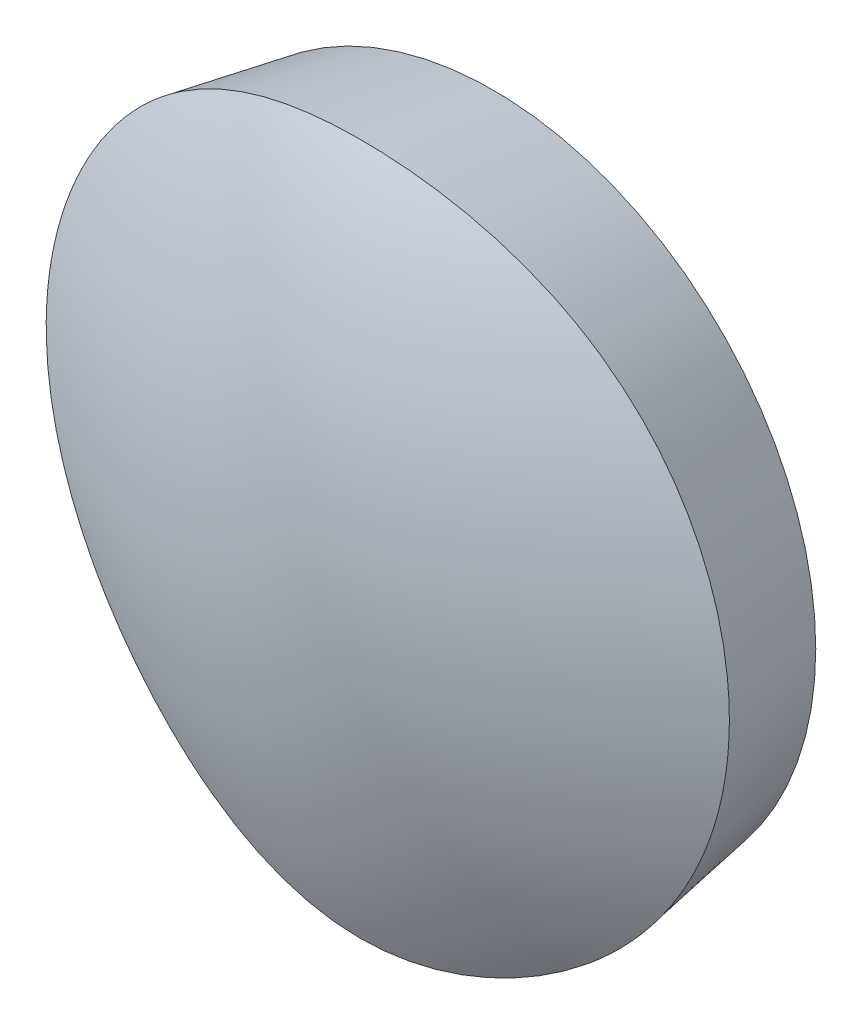
ISO-10303-21;
HEADER;
FILE_DESCRIPTION(('STEP AP214'),'2;1');
FILE_NAME('part.step','',(''),(''),'','','');
FILE_SCHEMA(('AUTOMOTIVE_DESIGN { 1 0 10303 214 1 1 1 1 }'));
ENDSEC;
DATA;
#1=APPLICATION_CONTEXT('core data for automotive mechanical design processes');
#2=APPLICATION_PROTOCOL_DEFINITION('international standard','automotive_design',2000,#1);
#3=PRODUCT_CONTEXT('',#1,'mechanical');
#4=PRODUCT('Part','Part','',(#3));
#5=PRODUCT_RELATED_PRODUCT_CATEGORY('part','',(#4));
#6=PRODUCT_DEFINITION_FORMATION('','',#4);
#7=PRODUCT_DEFINITION_CONTEXT('part definition',#1,'design');
#8=PRODUCT_DEFINITION('design','',#6,#7);
#9=PRODUCT_DEFINITION_SHAPE('','',#8);
#10=(LENGTH_UNIT() NAMED_UNIT(*) SI_UNIT(.MILLI.,.METRE.));
#11=(NAMED_UNIT(*) PLANE_ANGLE_UNIT() SI_UNIT($,.RADIAN.));
#12=(NAMED_UNIT(*) SI_UNIT($,.STERADIAN.) SOLID_ANGLE_UNIT());
#13=UNCERTAINTY_MEASURE_WITH_UNIT(LENGTH_MEASURE(1.E-05),#10,'distance_accuracy_value','');
#14=(GEOMETRIC_REPRESENTATION_CONTEXT(3) GLOBAL_UNCERTAINTY_ASSIGNED_CONTEXT((#13)) GLOBAL_UNIT_ASSIGNED_CONTEXT((#10,
#11,#12)) REPRESENTATION_CONTEXT('',''));
#15=CARTESIAN_POINT('',(0.,0.,0.));
#16=DIRECTION('',(0.,0.,1.));
#17=DIRECTION('',(1.,0.,0.));
#18=AXIS2_PLACEMENT_3D('',#15,#16,#17);
#19=CARTESIAN_POINT('',(0.,0.,0.));
#20=DIRECTION('',(0.,0.,1.));
#21=DIRECTION('',(1.,0.,0.));
#22=AXIS2_PLACEMENT_3D('',#19,#20,#21);
#23=CONICAL_SURFACE('',#22,15.,0.174532925199433);
#24=CARTESIAN_POINT('',(16.2329375433538,0.,6.99233627434661));
#25=CARTESIAN_POINT('',(16.2329350506365,-0.460523017316879,6.99233538323124));
#26=CARTESIAN_POINT('',(16.2134643773844,-0.921100037265326,6.99312577285012));
#27=CARTESIAN_POINT('',(16.1357299482676,-1.83900667263869,6.99639572411422));
#28=CARTESIAN_POINT('',(16.0774600113986,-2.2963357589102,6.99887555490113));
#29=CARTESIAN_POINT('',(15.922547334345,-3.20477158220653,7.00585027145508));
#30=CARTESIAN_POINT('',(15.8258774904151,-3.65587369084304,7.01034658079979));
#31=CARTESIAN_POINT('',(15.5949582506572,-4.54829860450103,7.02186163795036));
#32=CARTESIAN_POINT('',(15.460710315711,-4.98962178896732,7.028880287701));
#33=CARTESIAN_POINT('',(15.155803025611,-5.85916261300328,7.04607907245716));
#34=CARTESIAN_POINT('',(14.9851640575608,-6.28738743762138,7.05625743876467));
#35=CARTESIAN_POINT('',(14.6087865350685,-7.12801155964044,7.0804846729437));
#36=CARTESIAN_POINT('',(14.4030476940963,-7.54041072781849,7.09453357241202));
#37=CARTESIAN_POINT('',(13.9581305813142,-8.34644766004869,7.12717788739682));
#38=CARTESIAN_POINT('',(13.7189597372362,-8.74008956550487,7.14577229370377));
#39=CARTESIAN_POINT('',(13.2089763103295,-9.50602196981985,7.18804987362095));
#40=CARTESIAN_POINT('',(12.9381636453991,-9.87831241327377,7.21173306043529));
#41=CARTESIAN_POINT('',(12.364988713428,-10.601452184396,7.26465032665017));
#42=CARTESIAN_POINT('',(12.0624259396931,-10.9521399304152,7.29392077409049));
#43=CARTESIAN_POINT('',(11.429491665735,-11.6269226708874,7.3578173992772));
#44=CARTESIAN_POINT('',(11.099120016959,-11.9510175232651,7.39244360563444));
#45=CARTESIAN_POINT('',(10.4127610343185,-12.5705134000592,7.46649776169558));
#46=CARTESIAN_POINT('',(10.0567640564997,-12.865903522283,7.50592752309806));
#47=CARTESIAN_POINT('',(9.32165493208127,-13.4258002355531,7.58846918184698));
#48=CARTESIAN_POINT('',(8.94254249433459,-13.6903064374838,7.63158112557451));
#49=CARTESIAN_POINT('',(8.1601138842932,-14.1887692062153,7.72021873328189));
#50=CARTESIAN_POINT('',(7.75660954284019,-14.4224272771396,7.76576272699438));
#51=CARTESIAN_POINT('',(6.93110843402644,-14.8544942423622,7.85664208335077));
#52=CARTESIAN_POINT('',(6.50911152062745,-15.0529028582283,7.90197744434395));
#53=CARTESIAN_POINT('',(5.64945944780644,-15.4126348933501,7.98970063933227));
#54=CARTESIAN_POINT('',(5.21180952180036,-15.5739705760432,8.03208944477938));
#55=CARTESIAN_POINT('',(4.32352469610122,-15.8579598083201,8.11089345920394));
#56=CARTESIAN_POINT('',(3.87288979540866,-15.9806133549265,8.14730866772157));
#57=CARTESIAN_POINT('',(3.12003995406508,-16.1500777003267,8.19993879493228));
#58=CARTESIAN_POINT('',(2.8205614061218,-16.2084386036003,8.21877918567422));
#59=CARTESIAN_POINT('',(2.21844345423287,-16.3076216274538,8.25170277639331));
#60=CARTESIAN_POINT('',(1.91580416062319,-16.3484443581778,8.26578614186128));
#61=CARTESIAN_POINT('',(1.3084466932274,-16.4122226172115,8.28838686259572));
#62=CARTESIAN_POINT('',(1.00372871793955,-16.4351798281008,8.29690474200913));
#63=CARTESIAN_POINT('',(0.546091751428606,-16.4560422099295,8.30498417953992));
#64=CARTESIAN_POINT('',(0.39349545299342,-16.460734680831,8.30689455012238));
#65=CARTESIAN_POINT('',(0.0882191899482709,-16.46558366511,8.30906465989925));
#66=CARTESIAN_POINT('',(-0.0644607747244473,-16.4657401750806,8.30932439785389));
#67=CARTESIAN_POINT('',(-0.522410904243666,-16.4593993377146,8.30762251210617));
#68=CARTESIAN_POINT('',(-0.827609274963285,-16.4460924427115,8.30318011123243));
#69=CARTESIAN_POINT('',(-1.43647946926088,-16.401506686933,8.28835432809196));
#70=CARTESIAN_POINT('',(-1.74015139322481,-16.3702290240162,8.27797134180079));
#71=CARTESIAN_POINT('',(-2.4553610919574,-16.2753091280364,8.2472593364961));
#72=CARTESIAN_POINT('',(-2.86581105863856,-16.2040206133411,8.22468324415793));
#73=CARTESIAN_POINT('',(-3.67924312218226,-16.0293694890661,8.17196590477111));
#74=CARTESIAN_POINT('',(-4.08222574964094,-15.9260091677,8.14182519746118));
#75=CARTESIAN_POINT('',(-4.87875903333329,-15.6882097416447,8.07618420925249));
#76=CARTESIAN_POINT('',(-5.27230304784517,-15.5537494221088,8.04068027559295));
#77=CARTESIAN_POINT('',(-6.0475780441396,-15.2549634979909,7.96651209674264));
#78=CARTESIAN_POINT('',(-6.42930838448292,-15.0906362750631,7.92784768036283));
#79=CARTESIAN_POINT('',(-7.20269696333746,-14.7220583039283,7.84690054644939));
#80=CARTESIAN_POINT('',(-7.59345889518589,-14.5159412376786,7.80454355504945));
#81=CARTESIAN_POINT('',(-8.35719443699002,-14.072890233416,7.72065282150741));
#82=CARTESIAN_POINT('',(-8.73016755296308,-13.835955440297,7.6791191022457));
#83=CARTESIAN_POINT('',(-9.45613452389717,-13.3329152512586,7.59857531839341));
#84=CARTESIAN_POINT('',(-9.80913015007783,-13.0668124475605,7.55956503002951));
#85=CARTESIAN_POINT('',(-10.4930630733083,-12.5071462216778,7.48530376854955));
#86=CARTESIAN_POINT('',(-10.8239999126955,-12.2135822300486,7.45005287342202));
#87=CARTESIAN_POINT('',(-11.4788242686162,-11.5844330240495,7.38232390471772));
#88=CARTESIAN_POINT('',(-11.8013865172103,-11.2474397017763,7.3500952134875));
#89=CARTESIAN_POINT('',(-12.4173976839349,-10.5473586450054,7.29106735858224));
#90=CARTESIAN_POINT('',(-12.7108454588814,-10.1842698868309,7.26426840806375));
#91=CARTESIAN_POINT('',(-13.2664535802036,-9.43447486852502,7.21602994430587));
#92=CARTESIAN_POINT('',(-13.5286094575026,-9.04776524678006,7.19459119612762));
#93=CARTESIAN_POINT('',(-14.0195489650635,-8.25348627018925,7.15666644747792));
#94=CARTESIAN_POINT('',(-14.2483330065026,-7.8459171724384,7.14018038598136));
#95=CARTESIAN_POINT('',(-14.6700599205629,-7.01408544279394,7.11157256758852));
#96=CARTESIAN_POINT('',(-14.8631119610546,-6.58987862216499,7.09943740772708));
#97=CARTESIAN_POINT('',(-15.2126977611312,-5.72658760495567,7.0787384157425));
#98=CARTESIAN_POINT('',(-15.3692314770233,-5.28750339057577,7.07017458789232));
#99=CARTESIAN_POINT('',(-15.6444898933025,-4.39763118198355,7.05591179477935));
#100=CARTESIAN_POINT('',(-15.763217652592,-3.94684413784775,7.05021259771597));
#101=CARTESIAN_POINT('',(-15.9618985565273,-3.03678256456115,7.04107349460571));
#102=CARTESIAN_POINT('',(-16.0418519979273,-2.57750810039565,7.0376335712677));
#103=CARTESIAN_POINT('',(-16.1617925000944,-1.65783658736649,7.03259715981417));
#104=CARTESIAN_POINT('',(-16.2021220631791,-1.1974842676981,7.03098485504156));
#105=CARTESIAN_POINT('',(-16.2436934492337,-0.275016373869985,7.02932423751949));
#106=CARTESIAN_POINT('',(-16.2449355022461,0.187099189896476,7.0292759155655));
#107=CARTESIAN_POINT('',(-16.2083221348484,1.1097697461297,7.0307361511741));
#108=CARTESIAN_POINT('',(-16.1704672012166,1.57032475795454,7.03224468935294));
#109=CARTESIAN_POINT('',(-16.0559729856069,2.48657801343192,7.03703096508028));
#110=CARTESIAN_POINT('',(-15.9793337369832,2.9422762612609,7.04030870110727));
#111=CARTESIAN_POINT('',(-15.7883366457704,3.84350495389779,7.04902758618363));
#112=CARTESIAN_POINT('',(-15.6741521305736,4.28907224710213,7.05445881692887));
#113=CARTESIAN_POINT('',(-15.4088961593837,5.16904166616969,7.06805491065101));
#114=CARTESIAN_POINT('',(-15.257824853959,5.60344383759989,7.07621976246959));
#115=CARTESIAN_POINT('',(-14.919998834778,6.45805956541507,7.09595628375649));
#116=CARTESIAN_POINT('',(-14.7332442574069,6.87827317602299,7.10752794020373));
#117=CARTESIAN_POINT('',(-14.3255156951282,7.70161831526981,7.13477414608707));
#118=CARTESIAN_POINT('',(-14.1045415185185,8.10474974819624,7.15044871850852));
#119=CARTESIAN_POINT('',(-13.6286676675719,8.89350778438035,7.18662665085548));
#120=CARTESIAN_POINT('',(-13.3735746640395,9.27901646378208,7.20715808265794));
#121=CARTESIAN_POINT('',(-12.8324258158974,10.0273174600794,7.25343367413362));
#122=CARTESIAN_POINT('',(-12.546369890998,10.3901097180654,7.2791778473241));
#123=CARTESIAN_POINT('',(-11.9453983563715,11.090520745059,7.335999860154));
#124=CARTESIAN_POINT('',(-11.6304816172244,11.4281385279667,7.36707790856735));
#125=CARTESIAN_POINT('',(-10.9740448998126,12.0758906906912,7.43426403954389));
#126=CARTESIAN_POINT('',(-10.6325247304149,12.3860248730172,7.47037215824721));
#127=CARTESIAN_POINT('',(-9.92215435711165,12.9792397696738,7.54714415483503));
#128=CARTESIAN_POINT('',(-9.55309355129009,13.2620636439469,7.58784469255664));
#129=CARTESIAN_POINT('',(-8.79274851701214,13.7955634024818,7.6721540023946));
#130=CARTESIAN_POINT('',(-8.40146395137314,14.0462387987935,7.71576281863758));
#131=CARTESIAN_POINT('',(-7.59891280368938,14.51368935129,7.80397013614706));
#132=CARTESIAN_POINT('',(-7.18763663009369,14.7304480202824,7.8485691067814));
#133=CARTESIAN_POINT('',(-6.55799849477026,15.0286171793838,7.9143261266684));
#134=CARTESIAN_POINT('',(-6.3459908929724,15.1235149166938,7.93605562816824));
#135=CARTESIAN_POINT('',(-5.91796351533206,15.3041587218035,7.97879415292774));
#136=CARTESIAN_POINT('',(-5.70194252084854,15.3899019547601,7.9998029516509));
#137=CARTESIAN_POINT('',(-5.04859377698245,15.6329773420885,8.06118246265301));
#138=CARTESIAN_POINT('',(-4.60577810163943,15.7762510354259,8.09992802618263));
#139=CARTESIAN_POINT('',(-3.70881651279742,16.0235444308514,8.16997137536504));
#140=CARTESIAN_POINT('',(-3.25467166966495,16.1275678263998,8.20126986168669));
#141=CARTESIAN_POINT('',(-2.33893035236762,16.2948403874664,8.25328512150628));
#142=CARTESIAN_POINT('',(-1.87734492039049,16.3581451302825,8.27401631035414));
#143=CARTESIAN_POINT('',(-0.949982516405334,16.4430482249982,8.30211868641025));
#144=CARTESIAN_POINT('',(-0.484206352505674,16.4646544515976,8.30949239614149));
#145=CARTESIAN_POINT('',(0.411691055030618,16.465504600773,8.30860938867899));
#146=CARTESIAN_POINT('',(0.841813610762723,16.4478632888738,8.30150542989539));
#147=CARTESIAN_POINT('',(1.6987582205229,16.3769748511482,8.27570086600569));
#148=CARTESIAN_POINT('',(2.1255801215277,16.3237260843999,8.25699972646192));
#149=CARTESIAN_POINT('',(2.97322859214292,16.1824234888934,8.21019597909793));
#150=CARTESIAN_POINT('',(3.3940499730568,16.0943412308331,8.18208569490388));
#151=CARTESIAN_POINT('',(4.22667307063172,15.8844696150106,8.11889364137408));
#152=CARTESIAN_POINT('',(4.63847413837582,15.7626778407403,8.08381137229388));
#153=CARTESIAN_POINT('',(5.44666654166061,15.4879786903716,8.00950195478744));
#154=CARTESIAN_POINT('',(5.84316860176516,15.3353845793175,7.97031831032127));
#155=CARTESIAN_POINT('',(6.62277773935038,14.9996610724847,7.88980178346751));
#156=CARTESIAN_POINT('',(7.00588508833568,14.8165322960642,7.84846894468538));
#157=CARTESIAN_POINT('',(7.75664129268153,14.4211113561911,7.76569387931191));
#158=CARTESIAN_POINT('',(8.1242926765558,14.208823987368,7.72425167180093));
#159=CARTESIAN_POINT('',(8.84227742623399,13.7564575558658,7.64296049319375));
#160=CARTESIAN_POINT('',(9.19260992351844,13.5163771014133,7.60311160201941));
#161=CARTESIAN_POINT('',(9.90331879246726,12.9881427891376,7.52305262490856));
#162=CARTESIAN_POINT('',(10.2619759257001,12.6976313476021,7.48310515789943));
#163=CARTESIAN_POINT('',(10.954242066482,12.0875856519751,7.4078567159684));
#164=CARTESIAN_POINT('',(11.2878497234832,11.7680498350776,7.37255599149945));
#165=CARTESIAN_POINT('',(11.9277914025325,11.1020305895863,7.3072297626034));
#166=CARTESIAN_POINT('',(12.2341162043526,10.755538124564,7.2772060382244));
#167=CARTESIAN_POINT('',(12.8171333036967,10.0380692195028,7.22260316472862));
#168=CARTESIAN_POINT('',(13.0938261416005,9.66709322615428,7.19802391631555));
#169=CARTESIAN_POINT('',(13.6179834299141,8.89956425148705,7.15386001517399));
#170=CARTESIAN_POINT('',(13.8651459573239,8.50280215547214,7.13432491562787));
#171=CARTESIAN_POINT('',(14.3252311730872,7.6896705487691,7.100019830267));
#172=CARTESIAN_POINT('',(14.5381520270407,7.27329998915729,7.08525009970067));
#173=CARTESIAN_POINT('',(14.927882971685,6.42424281894259,7.0597873305662));
#174=CARTESIAN_POINT('',(15.1047192895241,5.99156833137125,7.04909132617669));
#175=CARTESIAN_POINT('',(15.4210106347235,5.11274866417483,7.03102135067298));
#176=CARTESIAN_POINT('',(15.5604722248203,4.66660586481778,7.02364679618081));
#177=CARTESIAN_POINT('',(15.7721180475358,3.87208890350441,7.01299025533802));
#178=CARTESIAN_POINT('',(15.8524155148761,3.52585827660826,7.00915125927472));
#179=CARTESIAN_POINT('',(15.9903698942407,2.8288184241674,7.00275724025257));
#180=CARTESIAN_POINT('',(16.0480225505475,2.47800835077889,7.00020245861534));
#181=CARTESIAN_POINT('',(16.1403746714526,1.77338415116071,6.99619180696904));
#182=CARTESIAN_POINT('',(16.1750748295286,1.41957011601869,6.99473590375869));
#183=CARTESIAN_POINT('',(16.221355004218,0.710514575283663,6.99280857582398));
#184=CARTESIAN_POINT('',(16.2329394663761,0.355273357332807,6.99233696180313));
#185=CARTESIAN_POINT('',(16.2329375433538,0.,6.99233627434661));
#186=B_SPLINE_CURVE_WITH_KNOTS('',3,(#24,#25,#26,#27,#28,#29,#30,#31,#32,#33,#34,#35,#36,#37,
#38,#39,#40,#41,#42,#43,#44,#45,#46,#47,#48,#49,#50,#51,#52,#53,#54,#55,#56,#57,#58,#59,#60,#61,
#62,#63,#64,#65,#66,#67,#68,#69,#70,#71,#72,#73,#74,#75,#76,#77,#78,#79,#80,#81,#82,#83,#84,#85,
#86,#87,#88,#89,#90,#91,#92,#93,#94,#95,#96,#97,#98,#99,#100,#101,#102,#103,#104,#105,#106,#107,
#108,#109,#110,#111,#112,#113,#114,#115,#116,#117,#118,#119,#120,#121,#122,#123,#124,#125,#126,
#127,#128,#129,#130,#131,#132,#133,#134,#135,#136,#137,#138,#139,#140,#141,#142,#143,#144,#145,
#146,#147,#148,#149,#150,#151,#152,#153,#154,#155,#156,#157,#158,#159,#160,#161,#162,#163,#164,
#165,#166,#167,#168,#169,#170,#171,#172,#173,#174,#175,#176,#177,#178,#179,#180,#181,#182,#183,
#184,#185),.UNSPECIFIED.,.T.,.F.,(4,2,2,2,2,2,2,2,2,2,2,2,2,2,2,2,2,2,2,2,2,2,2,2,2,2,2,2,2,2,2,
2,2,2,2,2,2,2,2,2,2,2,2,2,2,2,2,2,2,2,2,2,2,2,2,2,2,2,2,2,2,2,2,2,2,2,2,2,2,2,2,2,2,2,2,2,2,2,2,
2,4),(0.,1.38125141153327,2.76272291910475,4.14517124607608,5.52756583659712,6.9091880024121,
8.29082144733392,9.67214841526834,11.0534789674438,12.4441278448426,13.8347841514436,
15.225966588304,16.6171665511978,18.0209709652909,19.4247864674083,20.8281369276605,
22.231487495936,23.1480666114915,24.0646138371467,24.9810747316715,25.439049469102,
25.8970245505151,26.8129208351914,27.7287560770112,28.9788884942431,30.2289317393032,
31.4798302287625,32.7307965186891,34.0607921161901,35.3908246252365,36.7207390272419,
38.0506810129298,39.451803243259,40.852980467106,42.2543575668164,43.6557173985805,
45.0527224759946,46.4497292248651,47.846622912346,49.2435059087125,50.6282053688468,
52.0128966795862,53.3975707503914,54.7822436303868,56.1606118814887,57.5389745063138,
58.9173318629972,60.2956969416794,61.6822322702041,63.0687711942236,64.455364401332,
65.8419675713713,67.2405487126603,68.639151079128,70.0384312192852,70.7381198499617,
71.4380245261346,72.8371617742992,74.2361673305413,75.6332592951621,77.0300873953149,
78.320040467178,79.610052988901,80.9011205324697,82.1922806517843,83.4709171227311,
84.7495276612623,86.0279282053893,87.30639279473,88.6946002138487,90.0828824248026,
91.4716320388267,92.8603563227666,94.2622445604488,95.6642078752915,97.065148549657,
98.4658430673772,99.5314551162832,100.597267333631,101.663047347481,102.728622373796),.UNSPECIFIED.);
#187=CARTESIAN_POINT('',(16.2329375433538,0.,6.99233627434661));
#188=VERTEX_POINT('',#187);
#189=EDGE_CURVE('E10',#188,#188,#186,.T.);
#190=ORIENTED_EDGE('',*,*,#189,.T.);
#191=EDGE_LOOP('',(#190));
#192=FACE_BOUND('',#191,.T.);
#193=CARTESIAN_POINT('',(0.,0.,2.));
#194=DIRECTION('',(0.,0.,-1.));
#195=DIRECTION('',(-1.,0.,0.));
#196=AXIS2_PLACEMENT_3D('',#193,#194,#195);
#197=CIRCLE('',#196,15.3526539614169);
#198=CARTESIAN_POINT('',(-15.3526539614169,0.,2.));
#199=VERTEX_POINT('',#198);
#200=EDGE_CURVE('E43',#199,#199,#197,.T.);
#201=ORIENTED_EDGE('',*,*,#200,.F.);
#202=EDGE_LOOP('',(#201));
#203=FACE_BOUND('',#202,.T.);
#204=ADVANCED_FACE('F36',(#192,#203),#23,.T.);
#205=CARTESIAN_POINT('',(-24.0021039458,11.75,0.00989828675941606));
#206=CARTESIAN_POINT('',(-16.000751775601,15.3806080997778,3.50600378038314));
#207=CARTESIAN_POINT('',(-0.0350116413036981,22.625051815981,10.4820636520108));
#208=CARTESIAN_POINT('',(15.9229542735394,15.3694178082127,3.51205281950317));
#209=CARTESIAN_POINT('',(23.8834641274262,11.75,0.035115958630122));
#210=CARTESIAN_POINT('',(-24.5950206327404,4.0878307246568,2.79935198455153));
#211=CARTESIAN_POINT('',(-17.1613070897135,5.446271498258,8.06184416119364));
#212=CARTESIAN_POINT('',(-0.0407960914491719,8.57488280004084,20.1818370378354));
#213=CARTESIAN_POINT('',(17.076761011098,5.44208450040179,8.0632306955595));
#214=CARTESIAN_POINT('',(24.4763808143666,4.08783072465678,2.82456965642222));
#215=CARTESIAN_POINT('',(-24.5950206327404,-4.08783072465679,2.79935198455153));
#216=CARTESIAN_POINT('',(-17.1613070897135,-5.446271498258,8.06184416119364));
#217=CARTESIAN_POINT('',(-0.0407960914491702,-8.57488280004087,20.1818370378354));
#218=CARTESIAN_POINT('',(17.076761011098,-5.44208450040181,8.06323069555949));
#219=CARTESIAN_POINT('',(24.4763808143666,-4.0878307246568,2.82456965642222));
#220=CARTESIAN_POINT('',(-24.0021039458,-11.75,0.00989828675941606));
#221=CARTESIAN_POINT('',(-16.000751775601,-15.3806080997778,3.50600378038314));
#222=CARTESIAN_POINT('',(-0.0350116413036981,-22.625051815981,10.4820636520108));
#223=CARTESIAN_POINT('',(15.9229542735394,-15.3694178082127,3.51205281950316));
#224=CARTESIAN_POINT('',(23.8834641274262,-11.75,0.035115958630115));
#225=(BOUNDED_SURFACE() B_SPLINE_SURFACE(3,3,((#205,#206,#207,#208,#209),(#210,#211,#212,#213,
#214),(#215,#216,#217,#218,#219),(#220,#221,#222,#223,#224)),.UNSPECIFIED.,.F.,.F.,
.F.) B_SPLINE_SURFACE_WITH_KNOTS((4,4),(4,1,4),(0.,1.),(0.,0.501157610163691,1.),
.UNSPECIFIED.) GEOMETRIC_REPRESENTATION_ITEM() RATIONAL_B_SPLINE_SURFACE(((1.,1.,1.,1.,1.),
(0.958128388986927,0.958128388986927,0.868870934865996,0.958128388986927,0.958128388986927),
(0.958128388986927,0.958128388986927,0.868870934865996,0.958128388986927,0.958128388986927),(1.,
1.,1.,1.,1.))) REPRESENTATION_ITEM('') SURFACE());
#226=ORIENTED_EDGE('',*,*,#189,.F.);
#227=EDGE_LOOP('',(#226));
#228=FACE_BOUND('',#227,.T.);
#229=ADVANCED_FACE('F38',(#228),#225,.T.);
#230=CARTESIAN_POINT('',(0.,0.,2.));
#231=DIRECTION('',(0.,0.,-1.));
#232=DIRECTION('',(-1.,0.,0.));
#233=AXIS2_PLACEMENT_3D('',#230,#231,#232);
#234=PLANE('',#233);
#235=CARTESIAN_POINT('',(0.,0.,2.));
#236=DIRECTION('',(0.,0.,-1.));
#237=DIRECTION('',(-1.,0.,0.));
#238=AXIS2_PLACEMENT_3D('',#235,#236,#237);
#239=CIRCLE('',#238,15.2526539614169);
#240=CARTESIAN_POINT('',(-15.2526539614169,0.,2.));
#241=VERTEX_POINT('',#240);
#242=EDGE_CURVE('E74',#241,#241,#239,.T.);
#243=ORIENTED_EDGE('',*,*,#242,.F.);
#244=EDGE_LOOP('',(#243));
#245=FACE_BOUND('',#244,.T.);
#246=ORIENTED_EDGE('',*,*,#200,.T.);
#247=EDGE_LOOP('',(#246));
#248=FACE_BOUND('',#247,.T.);
#249=ADVANCED_FACE('F59',(#245,#248),#234,.T.);
#250=CARTESIAN_POINT('',(0.,0.,2.));
#251=DIRECTION('',(0.,0.,1.));
#252=DIRECTION('',(-1.,0.,0.));
#253=AXIS2_PLACEMENT_3D('',#250,#251,#252);
#254=CONICAL_SURFACE('',#253,15.2526539614169,0.174532925199433);
#255=CARTESIAN_POINT('',(0.,0.,7.));
#256=DIRECTION('',(0.,0.,-1.));
#257=DIRECTION('',(-1.,0.,0.));
#258=AXIS2_PLACEMENT_3D('',#255,#256,#257);
#259=CIRCLE('',#258,16.1342888649593);
#260=CARTESIAN_POINT('',(-16.1342888649593,0.,7.));
#261=VERTEX_POINT('',#260);
#262=EDGE_CURVE('E50',#261,#261,#259,.T.);
#263=ORIENTED_EDGE('',*,*,#262,.F.);
#264=EDGE_LOOP('',(#263));
#265=FACE_BOUND('',#264,.T.);
#266=ORIENTED_EDGE('',*,*,#242,.T.);
#267=EDGE_LOOP('',(#266));
#268=FACE_BOUND('',#267,.T.);
#269=ADVANCED_FACE('F62',(#265,#268),#254,.F.);
#270=CARTESIAN_POINT('',(0.,0.,7.));
#271=DIRECTION('',(0.,0.,-1.));
#272=DIRECTION('',(-1.,0.,0.));
#273=AXIS2_PLACEMENT_3D('',#270,#271,#272);
#274=PLANE('',#273);
#275=ORIENTED_EDGE('',*,*,#262,.T.);
#276=EDGE_LOOP('',(#275));
#277=FACE_BOUND('',#276,.T.);
#278=ADVANCED_FACE('F66',(#277),#274,.T.);
#279=CLOSED_SHELL('',(#204,#229,#249,#269,#278));
#280=MANIFOLD_SOLID_BREP('B2',#279);
#281=ADVANCED_BREP_SHAPE_REPRESENTATION('',(#18,#280),#14);
#282=SHAPE_DEFINITION_REPRESENTATION(#9,#281);
ENDSEC;
END-ISO-10303-21;
